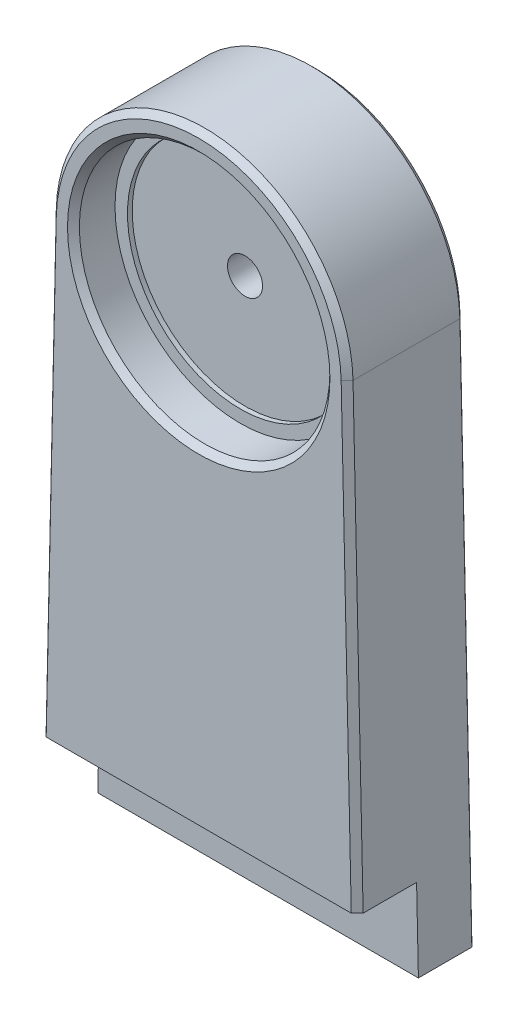
ISO-10303-21;
HEADER;
FILE_DESCRIPTION(('STEP AP214'),'2;1');
FILE_NAME('part.step','',(''),(''),'','','');
FILE_SCHEMA(('AUTOMOTIVE_DESIGN { 1 0 10303 214 1 1 1 1 }'));
ENDSEC;
DATA;
#1=APPLICATION_CONTEXT('core data for automotive mechanical design processes');
#2=APPLICATION_PROTOCOL_DEFINITION('international standard','automotive_design',2000,#1);
#3=PRODUCT_CONTEXT('',#1,'mechanical');
#4=PRODUCT('Part','Part','',(#3));
#5=PRODUCT_RELATED_PRODUCT_CATEGORY('part','',(#4));
#6=PRODUCT_DEFINITION_FORMATION('','',#4);
#7=PRODUCT_DEFINITION_CONTEXT('part definition',#1,'design');
#8=PRODUCT_DEFINITION('design','',#6,#7);
#9=PRODUCT_DEFINITION_SHAPE('','',#8);
#10=(LENGTH_UNIT() NAMED_UNIT(*) SI_UNIT(.MILLI.,.METRE.));
#11=(NAMED_UNIT(*) PLANE_ANGLE_UNIT() SI_UNIT($,.RADIAN.));
#12=(NAMED_UNIT(*) SI_UNIT($,.STERADIAN.) SOLID_ANGLE_UNIT());
#13=UNCERTAINTY_MEASURE_WITH_UNIT(LENGTH_MEASURE(1.E-05),#10,'distance_accuracy_value','');
#14=(GEOMETRIC_REPRESENTATION_CONTEXT(3) GLOBAL_UNCERTAINTY_ASSIGNED_CONTEXT((#13)) GLOBAL_UNIT_ASSIGNED_CONTEXT((#10,
#11,#12)) REPRESENTATION_CONTEXT('',''));
#15=CARTESIAN_POINT('',(0.,0.,0.));
#16=DIRECTION('',(0.,0.,1.));
#17=DIRECTION('',(1.,0.,0.));
#18=AXIS2_PLACEMENT_3D('',#15,#16,#17);
#19=CARTESIAN_POINT('',(-15.,-83.,20.));
#20=DIRECTION('',(0.,0.,-1.));
#21=DIRECTION('',(-1.,0.,0.));
#22=AXIS2_PLACEMENT_3D('',#19,#20,#21);
#23=CYLINDRICAL_SURFACE('',#22,1.55);
#24=CARTESIAN_POINT('',(-15.,-83.,10.));
#25=DIRECTION('',(0.,0.,-1.));
#26=DIRECTION('',(-1.,0.,0.));
#27=AXIS2_PLACEMENT_3D('',#24,#25,#26);
#28=CIRCLE('',#27,1.55);
#29=CARTESIAN_POINT('',(-16.55,-83.,10.));
#30=VERTEX_POINT('',#29);
#31=EDGE_CURVE('E290',#30,#30,#28,.T.);
#32=ORIENTED_EDGE('',*,*,#31,.F.);
#33=EDGE_LOOP('',(#32));
#34=FACE_BOUND('',#33,.T.);
#35=CARTESIAN_POINT('',(-15.,-83.,3.));
#36=DIRECTION('',(0.,0.,-1.));
#37=DIRECTION('',(-1.,0.,0.));
#38=AXIS2_PLACEMENT_3D('',#35,#36,#37);
#39=CIRCLE('',#38,1.55);
#40=CARTESIAN_POINT('',(-16.55,-83.,3.));
#41=VERTEX_POINT('',#40);
#42=EDGE_CURVE('E43',#41,#41,#39,.T.);
#43=ORIENTED_EDGE('',*,*,#42,.T.);
#44=EDGE_LOOP('',(#43));
#45=FACE_BOUND('',#44,.T.);
#46=ADVANCED_FACE('F38',(#34,#45),#23,.F.);
#47=CARTESIAN_POINT('',(0.,-83.,20.));
#48=DIRECTION('',(0.,0.,-1.));
#49=DIRECTION('',(-1.,0.,0.));
#50=AXIS2_PLACEMENT_3D('',#47,#48,#49);
#51=CYLINDRICAL_SURFACE('',#50,1.55);
#52=CARTESIAN_POINT('',(0.,-83.,10.));
#53=DIRECTION('',(0.,0.,-1.));
#54=DIRECTION('',(-1.,0.,0.));
#55=AXIS2_PLACEMENT_3D('',#52,#53,#54);
#56=CIRCLE('',#55,1.55);
#57=CARTESIAN_POINT('',(-1.55,-83.,10.));
#58=VERTEX_POINT('',#57);
#59=EDGE_CURVE('E158',#58,#58,#56,.T.);
#60=ORIENTED_EDGE('',*,*,#59,.F.);
#61=EDGE_LOOP('',(#60));
#62=FACE_BOUND('',#61,.T.);
#63=CARTESIAN_POINT('',(0.,-83.,3.));
#64=DIRECTION('',(0.,0.,-1.));
#65=DIRECTION('',(-1.,0.,0.));
#66=AXIS2_PLACEMENT_3D('',#63,#64,#65);
#67=CIRCLE('',#66,1.55);
#68=CARTESIAN_POINT('',(-1.55,-83.,3.));
#69=VERTEX_POINT('',#68);
#70=EDGE_CURVE('E253',#69,#69,#67,.T.);
#71=ORIENTED_EDGE('',*,*,#70,.T.);
#72=EDGE_LOOP('',(#71));
#73=FACE_BOUND('',#72,.T.);
#74=ADVANCED_FACE('F362',(#62,#73),#51,.F.);
#75=CARTESIAN_POINT('',(15.,-83.,20.));
#76=DIRECTION('',(0.,0.,-1.));
#77=DIRECTION('',(-1.,0.,0.));
#78=AXIS2_PLACEMENT_3D('',#75,#76,#77);
#79=CYLINDRICAL_SURFACE('',#78,1.55);
#80=CARTESIAN_POINT('',(15.,-83.,10.));
#81=DIRECTION('',(0.,0.,-1.));
#82=DIRECTION('',(-1.,0.,0.));
#83=AXIS2_PLACEMENT_3D('',#80,#81,#82);
#84=CIRCLE('',#83,1.55);
#85=CARTESIAN_POINT('',(13.45,-83.,10.));
#86=VERTEX_POINT('',#85);
#87=EDGE_CURVE('E155',#86,#86,#84,.T.);
#88=ORIENTED_EDGE('',*,*,#87,.F.);
#89=EDGE_LOOP('',(#88));
#90=FACE_BOUND('',#89,.T.);
#91=CARTESIAN_POINT('',(15.,-83.,3.));
#92=DIRECTION('',(0.,0.,-1.));
#93=DIRECTION('',(-1.,0.,0.));
#94=AXIS2_PLACEMENT_3D('',#91,#92,#93);
#95=CIRCLE('',#94,1.55);
#96=CARTESIAN_POINT('',(13.45,-83.,3.));
#97=VERTEX_POINT('',#96);
#98=EDGE_CURVE('E250',#97,#97,#95,.T.);
#99=ORIENTED_EDGE('',*,*,#98,.T.);
#100=EDGE_LOOP('',(#99));
#101=FACE_BOUND('',#100,.T.);
#102=ADVANCED_FACE('F330',(#90,#101),#79,.F.);
#103=CARTESIAN_POINT('',(0.,0.,20.));
#104=DIRECTION('',(0.,0.,-1.));
#105=DIRECTION('',(-1.,0.,0.));
#106=AXIS2_PLACEMENT_3D('',#103,#104,#105);
#107=CYLINDRICAL_SURFACE('',#106,2.95);
#108=CARTESIAN_POINT('',(0.,0.,0.));
#109=DIRECTION('',(0.,0.,1.));
#110=DIRECTION('',(1.,0.,0.));
#111=AXIS2_PLACEMENT_3D('',#108,#109,#110);
#112=CIRCLE('',#111,2.95);
#113=CARTESIAN_POINT('',(2.95,0.,0.));
#114=VERTEX_POINT('',#113);
#115=EDGE_CURVE('E295',#114,#114,#112,.T.);
#116=ORIENTED_EDGE('',*,*,#115,.F.);
#117=EDGE_LOOP('',(#116));
#118=FACE_BOUND('',#117,.T.);
#119=CARTESIAN_POINT('',(0.,0.,12.2));
#120=DIRECTION('',(0.,0.,1.));
#121=DIRECTION('',(1.,0.,0.));
#122=AXIS2_PLACEMENT_3D('',#119,#120,#121);
#123=CIRCLE('',#122,2.95);
#124=CARTESIAN_POINT('',(2.95,0.,12.2));
#125=VERTEX_POINT('',#124);
#126=EDGE_CURVE('E161',#125,#125,#123,.T.);
#127=ORIENTED_EDGE('',*,*,#126,.T.);
#128=EDGE_LOOP('',(#127));
#129=FACE_BOUND('',#128,.T.);
#130=ADVANCED_FACE('F327',(#118,#129),#107,.F.);
#131=CARTESIAN_POINT('',(0.,0.,20.));
#132=DIRECTION('',(0.,0.,1.));
#133=DIRECTION('',(1.,0.,0.));
#134=AXIS2_PLACEMENT_3D('',#131,#132,#133);
#135=PLANE('',#134);
#136=CARTESIAN_POINT('',(0.,0.,20.));
#137=DIRECTION('',(0.,0.,1.));
#138=DIRECTION('',(1.,0.,0.));
#139=AXIS2_PLACEMENT_3D('',#136,#137,#138);
#140=CIRCLE('',#139,22.1);
#141=CARTESIAN_POINT('',(22.1,0.,20.));
#142=VERTEX_POINT('',#141);
#143=EDGE_CURVE('E194',#142,#142,#140,.F.);
#144=ORIENTED_EDGE('',*,*,#143,.T.);
#145=EDGE_LOOP('',(#144));
#146=FACE_BOUND('',#145,.T.);
#147=DIRECTION('',(-1.,0.,0.));
#148=VECTOR('',#147,1.);
#149=CARTESIAN_POINT('',(-27.,-76.2,20.));
#150=LINE('',#149,#148);
#151=CARTESIAN_POINT('',(25.6939593819547,-76.2,20.));
#152=VERTEX_POINT('',#151);
#153=CARTESIAN_POINT('',(-25.6939919283633,-76.2,20.));
#154=VERTEX_POINT('',#153);
#155=EDGE_CURVE('E140',#152,#154,#150,.T.);
#156=ORIENTED_EDGE('',*,*,#155,.F.);
#157=DIRECTION('',(-0.0221508526224699,0.999754639763226,0.));
#158=VECTOR('',#157,1.);
#159=CARTESIAN_POINT('',(23.9914406171151,0.641332631401685,20.));
#160=LINE('',#159,#158);
#161=CARTESIAN_POINT('',(23.9914897321568,0.63911587741423,20.));
#162=VERTEX_POINT('',#161);
#163=EDGE_CURVE('E192',#152,#162,#160,.T.);
#164=ORIENTED_EDGE('',*,*,#163,.T.);
#165=CARTESIAN_POINT('',(0.,0.,20.));
#166=DIRECTION('',(0.,0.,1.));
#167=DIRECTION('',(1.,0.,0.));
#168=AXIS2_PLACEMENT_3D('',#165,#166,#167);
#169=CIRCLE('',#168,24.0000010140198);
#170=CARTESIAN_POINT('',(-23.9914894068359,0.639128089376715,20.));
#171=VERTEX_POINT('',#170);
#172=EDGE_CURVE('E56',#162,#171,#169,.T.);
#173=ORIENTED_EDGE('',*,*,#172,.T.);
#174=DIRECTION('',(-0.0221512765883186,-0.999754630369626,0.));
#175=VECTOR('',#174,1.);
#176=CARTESIAN_POINT('',(-25.6944827278451,-76.2221512765883,20.));
#177=LINE('',#176,#175);
#178=EDGE_CURVE('E190',#171,#154,#177,.T.);
#179=ORIENTED_EDGE('',*,*,#178,.T.);
#180=EDGE_LOOP('',(#156,#164,#173,#179));
#181=FACE_BOUND('',#180,.T.);
#182=ADVANCED_FACE('F322',(#146,#181),#135,.T.);
#183=CARTESIAN_POINT('',(0.,0.,0.));
#184=DIRECTION('',(0.,0.,1.));
#185=DIRECTION('',(1.,0.,0.));
#186=AXIS2_PLACEMENT_3D('',#183,#184,#185);
#187=PLANE('',#186);
#188=CARTESIAN_POINT('',(0.,-83.,0.));
#189=DIRECTION('',(0.,0.,-1.));
#190=DIRECTION('',(-1.,0.,0.));
#191=AXIS2_PLACEMENT_3D('',#188,#189,#190);
#192=CIRCLE('',#191,3.);
#193=CARTESIAN_POINT('',(-3.,-83.,0.));
#194=VERTEX_POINT('',#193);
#195=EDGE_CURVE('E261',#194,#194,#192,.T.);
#196=ORIENTED_EDGE('',*,*,#195,.F.);
#197=EDGE_LOOP('',(#196));
#198=FACE_BOUND('',#197,.T.);
#199=CARTESIAN_POINT('',(-15.,-83.,0.));
#200=DIRECTION('',(0.,0.,-1.));
#201=DIRECTION('',(-1.,0.,0.));
#202=AXIS2_PLACEMENT_3D('',#199,#200,#201);
#203=CIRCLE('',#202,3.);
#204=CARTESIAN_POINT('',(-18.,-83.,0.));
#205=VERTEX_POINT('',#204);
#206=EDGE_CURVE('E271',#205,#205,#203,.T.);
#207=ORIENTED_EDGE('',*,*,#206,.F.);
#208=EDGE_LOOP('',(#207));
#209=FACE_BOUND('',#208,.T.);
#210=CARTESIAN_POINT('',(15.,-83.,0.));
#211=DIRECTION('',(0.,0.,-1.));
#212=DIRECTION('',(-1.,0.,0.));
#213=AXIS2_PLACEMENT_3D('',#210,#211,#212);
#214=CIRCLE('',#213,3.);
#215=CARTESIAN_POINT('',(12.,-83.,0.));
#216=VERTEX_POINT('',#215);
#217=EDGE_CURVE('E259',#216,#216,#214,.T.);
#218=ORIENTED_EDGE('',*,*,#217,.F.);
#219=EDGE_LOOP('',(#218));
#220=FACE_BOUND('',#219,.T.);
#221=DIRECTION('',(1.,0.,0.));
#222=VECTOR('',#221,1.);
#223=CARTESIAN_POINT('',(0.,-90.,0.));
#224=LINE('',#223,#222);
#225=CARTESIAN_POINT('',(-25.9997545701486,-90.,0.));
#226=VERTEX_POINT('',#225);
#227=CARTESIAN_POINT('',(25.9997161687024,-90.,0.));
#228=VERTEX_POINT('',#227);
#229=EDGE_CURVE('E298',#226,#228,#224,.T.);
#230=ORIENTED_EDGE('',*,*,#229,.F.);
#231=DIRECTION('',(0.0221512765883186,0.999754630369626,0.));
#232=VECTOR('',#231,1.);
#233=CARTESIAN_POINT('',(-23.9938713147598,0.531625324627168,0.));
#234=LINE('',#233,#232);
#235=CARTESIAN_POINT('',(-23.9914894068359,0.639128089377514,0.));
#236=VERTEX_POINT('',#235);
#237=EDGE_CURVE('E176',#226,#236,#234,.T.);
#238=ORIENTED_EDGE('',*,*,#237,.T.);
#239=CARTESIAN_POINT('',(0.,0.,0.));
#240=DIRECTION('',(0.,0.,1.));
#241=DIRECTION('',(1.,0.,0.));
#242=AXIS2_PLACEMENT_3D('',#239,#240,#241);
#243=CIRCLE('',#242,24.0000010140198);
#244=CARTESIAN_POINT('',(23.9914897321569,0.639115877415421,0.));
#245=VERTEX_POINT('',#244);
#246=EDGE_CURVE('E174',#236,#245,#243,.F.);
#247=ORIENTED_EDGE('',*,*,#246,.T.);
#248=DIRECTION('',(0.0221508526224699,-0.999754639763226,0.));
#249=VECTOR('',#248,1.);
#250=CARTESIAN_POINT('',(23.9938715493354,0.531615149750818,0.));
#251=LINE('',#250,#249);
#252=EDGE_CURVE('E172',#245,#228,#251,.T.);
#253=ORIENTED_EDGE('',*,*,#252,.T.);
#254=EDGE_LOOP('',(#230,#238,#247,#253));
#255=FACE_BOUND('',#254,.T.);
#256=ORIENTED_EDGE('',*,*,#115,.T.);
#257=EDGE_LOOP('',(#256));
#258=FACE_BOUND('',#257,.T.);
#259=ADVANCED_FACE('F319',(#198,#209,#220,#255,#258),#187,.F.);
#260=CARTESIAN_POINT('',(0.,0.,20.));
#261=DIRECTION('',(0.,0.,-1.));
#262=DIRECTION('',(-1.,0.,0.));
#263=AXIS2_PLACEMENT_3D('',#260,#261,#262);
#264=CYLINDRICAL_SURFACE('',#263,25.0000010140198);
#265=DIRECTION('',(0.,0.,-1.));
#266=VECTOR('',#265,1.);
#267=CARTESIAN_POINT('',(24.9911952568783,0.663483484024156,20.));
#268=LINE('',#267,#266);
#269=CARTESIAN_POINT('',(24.9911952568783,0.663483484024156,19.));
#270=VERTEX_POINT('',#269);
#271=CARTESIAN_POINT('',(24.9911952568783,0.663483484024156,1.));
#272=VERTEX_POINT('',#271);
#273=EDGE_CURVE('E151',#270,#272,#268,.T.);
#274=ORIENTED_EDGE('',*,*,#273,.T.);
#275=CARTESIAN_POINT('',(0.,0.,1.));
#276=DIRECTION('',(0.,0.,1.));
#277=DIRECTION('',(1.,0.,0.));
#278=AXIS2_PLACEMENT_3D('',#275,#276,#277);
#279=CIRCLE('',#278,25.0000010140198);
#280=CARTESIAN_POINT('',(-24.9911949202926,0.663496161958768,1.));
#281=VERTEX_POINT('',#280);
#282=EDGE_CURVE('E180',#272,#281,#279,.T.);
#283=ORIENTED_EDGE('',*,*,#282,.T.);
#284=DIRECTION('',(0.,0.,-1.));
#285=VECTOR('',#284,1.);
#286=CARTESIAN_POINT('',(-24.9911949202926,0.663496161958768,20.));
#287=LINE('',#286,#285);
#288=CARTESIAN_POINT('',(-24.9911949202926,0.663496161958768,19.));
#289=VERTEX_POINT('',#288);
#290=EDGE_CURVE('E147',#289,#281,#287,.T.);
#291=ORIENTED_EDGE('',*,*,#290,.F.);
#292=CARTESIAN_POINT('',(0.,0.,19.));
#293=DIRECTION('',(0.,0.,1.));
#294=DIRECTION('',(1.,0.,0.));
#295=AXIS2_PLACEMENT_3D('',#292,#293,#294);
#296=CIRCLE('',#295,25.0000010140198);
#297=EDGE_CURVE('E178',#289,#270,#296,.F.);
#298=ORIENTED_EDGE('',*,*,#297,.T.);
#299=EDGE_LOOP('',(#274,#283,#291,#298));
#300=FACE_BOUND('',#299,.T.);
#301=ADVANCED_FACE('F304',(#300),#264,.T.);
#302=CARTESIAN_POINT('',(-24.9911949202926,0.663496161958768,20.));
#303=DIRECTION('',(0.999754630369626,-0.0221512765883186,0.));
#304=DIRECTION('',(0.0221512765883186,0.999754630369626,0.));
#305=AXIS2_PLACEMENT_3D('',#302,#303,#304);
#306=PLANE('',#305);
#307=ORIENTED_EDGE('',*,*,#290,.T.);
#308=DIRECTION('',(-0.0221512765883186,-0.999754630369626,0.));
#309=VECTOR('',#308,1.);
#310=CARTESIAN_POINT('',(-24.9911949202926,0.663496161958768,1.));
#311=LINE('',#310,#309);
#312=CARTESIAN_POINT('',(-27.,-90.,1.));
#313=VERTEX_POINT('',#312);
#314=EDGE_CURVE('E146',#281,#313,#311,.T.);
#315=ORIENTED_EDGE('',*,*,#314,.T.);
#316=DIRECTION('',(0.,0.,-1.));
#317=VECTOR('',#316,1.);
#318=CARTESIAN_POINT('',(-27.,-90.,20.));
#319=LINE('',#318,#317);
#320=CARTESIAN_POINT('',(-27.,-90.,10.));
#321=VERTEX_POINT('',#320);
#322=EDGE_CURVE('E137',#321,#313,#319,.T.);
#323=ORIENTED_EDGE('',*,*,#322,.F.);
#324=DIRECTION('',(0.0221512765883186,0.999754630369626,0.));
#325=VECTOR('',#324,1.);
#326=CARTESIAN_POINT('',(-24.9911949202926,0.663496161958768,10.));
#327=LINE('',#326,#325);
#328=CARTESIAN_POINT('',(-26.6942373582148,-76.2,10.));
#329=VERTEX_POINT('',#328);
#330=EDGE_CURVE('E119',#321,#329,#327,.T.);
#331=ORIENTED_EDGE('',*,*,#330,.T.);
#332=DIRECTION('',(0.,0.,1.));
#333=VECTOR('',#332,1.);
#334=CARTESIAN_POINT('',(-26.6942373582148,-76.2,20.));
#335=LINE('',#334,#333);
#336=CARTESIAN_POINT('',(-26.6942373582148,-76.2,19.));
#337=VERTEX_POINT('',#336);
#338=EDGE_CURVE('E130',#329,#337,#335,.T.);
#339=ORIENTED_EDGE('',*,*,#338,.T.);
#340=DIRECTION('',(0.0221512765883186,0.999754630369626,0.));
#341=VECTOR('',#340,1.);
#342=CARTESIAN_POINT('',(-24.9911949202926,0.663496161958768,19.));
#343=LINE('',#342,#341);
#344=EDGE_CURVE('E160',#337,#289,#343,.T.);
#345=ORIENTED_EDGE('',*,*,#344,.T.);
#346=EDGE_LOOP('',(#307,#315,#323,#331,#339,#345));
#347=FACE_BOUND('',#346,.T.);
#348=ADVANCED_FACE('F144',(#347),#306,.F.);
#349=CARTESIAN_POINT('',(0.,-90.,20.));
#350=DIRECTION('',(0.,1.,0.));
#351=DIRECTION('',(0.,0.,1.));
#352=AXIS2_PLACEMENT_3D('',#349,#350,#351);
#353=PLANE('',#352);
#354=ORIENTED_EDGE('',*,*,#322,.T.);
#355=DIRECTION('',(-0.707193537772192,0.,0.707020013955228));
#356=VECTOR('',#355,1.);
#357=CARTESIAN_POINT('',(-25.9953509800307,-90.,-0.00440250961062597));
#358=LINE('',#357,#356);
#359=EDGE_CURVE('E170',#313,#226,#358,.F.);
#360=ORIENTED_EDGE('',*,*,#359,.T.);
#361=ORIENTED_EDGE('',*,*,#229,.T.);
#362=DIRECTION('',(-0.707193534450645,0.,-0.707020017277591));
#363=VECTOR('',#362,1.);
#364=CARTESIAN_POINT('',(25.9953319570928,-90.,-0.0043831358984539));
#365=LINE('',#364,#363);
#366=CARTESIAN_POINT('',(26.9999615891556,-90.,1.));
#367=VERTEX_POINT('',#366);
#368=EDGE_CURVE('E168',#228,#367,#365,.F.);
#369=ORIENTED_EDGE('',*,*,#368,.T.);
#370=DIRECTION('',(0.,0.,-1.));
#371=VECTOR('',#370,1.);
#372=CARTESIAN_POINT('',(26.9999615891556,-90.,20.));
#373=LINE('',#372,#371);
#374=CARTESIAN_POINT('',(26.9999615891556,-90.,10.));
#375=VERTEX_POINT('',#374);
#376=EDGE_CURVE('E139',#375,#367,#373,.T.);
#377=ORIENTED_EDGE('',*,*,#376,.F.);
#378=DIRECTION('',(1.,0.,0.));
#379=VECTOR('',#378,1.);
#380=CARTESIAN_POINT('',(26.9999615891556,-90.,10.));
#381=LINE('',#380,#379);
#382=EDGE_CURVE('E123',#321,#375,#381,.T.);
#383=ORIENTED_EDGE('',*,*,#382,.F.);
#384=EDGE_LOOP('',(#354,#360,#361,#369,#377,#383));
#385=FACE_BOUND('',#384,.T.);
#386=ADVANCED_FACE('F136',(#385),#353,.F.);
#387=CARTESIAN_POINT('',(24.9911952568783,0.663483484024156,20.));
#388=DIRECTION('',(-0.999754639763226,-0.0221508526224699,0.));
#389=DIRECTION('',(0.0221508526224699,-0.999754639763226,0.));
#390=AXIS2_PLACEMENT_3D('',#387,#388,#389);
#391=PLANE('',#390);
#392=ORIENTED_EDGE('',*,*,#376,.T.);
#393=DIRECTION('',(-0.0221508526224699,0.999754639763226,0.));
#394=VECTOR('',#393,1.);
#395=CARTESIAN_POINT('',(24.9911952568783,0.663483484024156,1.));
#396=LINE('',#395,#394);
#397=EDGE_CURVE('E184',#367,#272,#396,.T.);
#398=ORIENTED_EDGE('',*,*,#397,.T.);
#399=ORIENTED_EDGE('',*,*,#273,.F.);
#400=DIRECTION('',(0.0221508526224699,-0.999754639763226,0.));
#401=VECTOR('',#400,1.);
#402=CARTESIAN_POINT('',(26.6942048024079,-76.2,19.));
#403=LINE('',#402,#401);
#404=CARTESIAN_POINT('',(26.6942048024079,-76.2,19.));
#405=VERTEX_POINT('',#404);
#406=EDGE_CURVE('E182',#270,#405,#403,.T.);
#407=ORIENTED_EDGE('',*,*,#406,.T.);
#408=DIRECTION('',(0.,0.,-1.));
#409=VECTOR('',#408,1.);
#410=CARTESIAN_POINT('',(26.6942048024079,-76.2,20.));
#411=LINE('',#410,#409);
#412=CARTESIAN_POINT('',(26.6942048024079,-76.2,10.));
#413=VERTEX_POINT('',#412);
#414=EDGE_CURVE('E149',#405,#413,#411,.T.);
#415=ORIENTED_EDGE('',*,*,#414,.T.);
#416=DIRECTION('',(0.0221508526224699,-0.999754639763226,0.));
#417=VECTOR('',#416,1.);
#418=CARTESIAN_POINT('',(24.9911952568783,0.663483484024156,10.));
#419=LINE('',#418,#417);
#420=EDGE_CURVE('E131',#413,#375,#419,.T.);
#421=ORIENTED_EDGE('',*,*,#420,.T.);
#422=EDGE_LOOP('',(#392,#398,#399,#407,#415,#421));
#423=FACE_BOUND('',#422,.T.);
#424=ADVANCED_FACE('F376',(#423),#391,.F.);
#425=CARTESIAN_POINT('',(-27.,-76.2,10.));
#426=DIRECTION('',(0.,1.,0.));
#427=DIRECTION('',(0.,0.,1.));
#428=AXIS2_PLACEMENT_3D('',#425,#426,#427);
#429=PLANE('',#428);
#430=ORIENTED_EDGE('',*,*,#414,.F.);
#431=DIRECTION('',(-0.707193534450644,0.,0.707020017277592));
#432=VECTOR('',#431,1.);
#433=CARTESIAN_POINT('',(24.8437068730814,-76.2,20.8500438907164));
#434=LINE('',#433,#432);
#435=EDGE_CURVE('E11',#405,#152,#434,.T.);
#436=ORIENTED_EDGE('',*,*,#435,.T.);
#437=ORIENTED_EDGE('',*,*,#155,.T.);
#438=DIRECTION('',(-0.707193537772191,0.,-0.70702001395523));
#439=VECTOR('',#438,1.);
#440=CARTESIAN_POINT('',(-24.8437230169888,-76.2,20.850060281206));
#441=LINE('',#440,#439);
#442=EDGE_CURVE('E48',#154,#337,#441,.T.);
#443=ORIENTED_EDGE('',*,*,#442,.T.);
#444=ORIENTED_EDGE('',*,*,#338,.F.);
#445=DIRECTION('',(-1.,0.,0.));
#446=VECTOR('',#445,1.);
#447=CARTESIAN_POINT('',(-27.,-76.2,10.));
#448=LINE('',#447,#446);
#449=EDGE_CURVE('E126',#413,#329,#448,.T.);
#450=ORIENTED_EDGE('',*,*,#449,.F.);
#451=EDGE_LOOP('',(#430,#436,#437,#443,#444,#450));
#452=FACE_BOUND('',#451,.T.);
#453=ADVANCED_FACE('F358',(#452),#429,.F.);
#454=CARTESIAN_POINT('',(0.,0.,10.));
#455=DIRECTION('',(0.,0.,-1.));
#456=DIRECTION('',(-1.,0.,0.));
#457=AXIS2_PLACEMENT_3D('',#454,#455,#456);
#458=PLANE('',#457);
#459=ORIENTED_EDGE('',*,*,#31,.T.);
#460=EDGE_LOOP('',(#459));
#461=FACE_BOUND('',#460,.T.);
#462=ORIENTED_EDGE('',*,*,#59,.T.);
#463=EDGE_LOOP('',(#462));
#464=FACE_BOUND('',#463,.T.);
#465=ORIENTED_EDGE('',*,*,#87,.T.);
#466=EDGE_LOOP('',(#465));
#467=FACE_BOUND('',#466,.T.);
#468=ORIENTED_EDGE('',*,*,#382,.T.);
#469=ORIENTED_EDGE('',*,*,#420,.F.);
#470=ORIENTED_EDGE('',*,*,#449,.T.);
#471=ORIENTED_EDGE('',*,*,#330,.F.);
#472=EDGE_LOOP('',(#468,#469,#470,#471));
#473=FACE_BOUND('',#472,.T.);
#474=ADVANCED_FACE('F121',(#461,#464,#467,#473),#458,.F.);
#475=CARTESIAN_POINT('',(0.,0.,13.));
#476=DIRECTION('',(0.,0.,1.));
#477=DIRECTION('',(1.,0.,0.));
#478=AXIS2_PLACEMENT_3D('',#475,#476,#477);
#479=CYLINDRICAL_SURFACE('',#478,21.1);
#480=CARTESIAN_POINT('',(0.,0.,19.));
#481=DIRECTION('',(0.,0.,1.));
#482=DIRECTION('',(1.,0.,0.));
#483=AXIS2_PLACEMENT_3D('',#480,#481,#482);
#484=CIRCLE('',#483,21.1);
#485=CARTESIAN_POINT('',(21.1,0.,19.));
#486=VERTEX_POINT('',#485);
#487=EDGE_CURVE('E186',#486,#486,#484,.T.);
#488=ORIENTED_EDGE('',*,*,#487,.T.);
#489=EDGE_LOOP('',(#488));
#490=FACE_BOUND('',#489,.T.);
#491=CARTESIAN_POINT('',(0.,0.,13.));
#492=DIRECTION('',(0.,0.,1.));
#493=DIRECTION('',(1.,0.,0.));
#494=AXIS2_PLACEMENT_3D('',#491,#492,#493);
#495=CIRCLE('',#494,21.1);
#496=CARTESIAN_POINT('',(21.1,0.,13.));
#497=VERTEX_POINT('',#496);
#498=EDGE_CURVE('E164',#497,#497,#495,.T.);
#499=ORIENTED_EDGE('',*,*,#498,.F.);
#500=EDGE_LOOP('',(#499));
#501=FACE_BOUND('',#500,.T.);
#502=ADVANCED_FACE('F348',(#490,#501),#479,.F.);
#503=CARTESIAN_POINT('',(0.,0.,13.));
#504=DIRECTION('',(0.,0.,1.));
#505=DIRECTION('',(1.,0.,0.));
#506=AXIS2_PLACEMENT_3D('',#503,#504,#505);
#507=PLANE('',#506);
#508=CARTESIAN_POINT('',(0.,0.,13.));
#509=DIRECTION('',(0.,0.,1.));
#510=DIRECTION('',(1.,0.,0.));
#511=AXIS2_PLACEMENT_3D('',#508,#509,#510);
#512=CIRCLE('',#511,19.);
#513=CARTESIAN_POINT('',(19.,0.,13.));
#514=VERTEX_POINT('',#513);
#515=EDGE_CURVE('E280',#514,#514,#512,.T.);
#516=ORIENTED_EDGE('',*,*,#515,.F.);
#517=EDGE_LOOP('',(#516));
#518=FACE_BOUND('',#517,.T.);
#519=ORIENTED_EDGE('',*,*,#498,.T.);
#520=EDGE_LOOP('',(#519));
#521=FACE_BOUND('',#520,.T.);
#522=ADVANCED_FACE('F342',(#518,#521),#507,.T.);
#523=CARTESIAN_POINT('',(0.,0.,12.2));
#524=DIRECTION('',(0.,0.,1.));
#525=DIRECTION('',(1.,0.,0.));
#526=AXIS2_PLACEMENT_3D('',#523,#524,#525);
#527=CYLINDRICAL_SURFACE('',#526,19.);
#528=CARTESIAN_POINT('',(0.,0.,12.2));
#529=DIRECTION('',(0.,0.,1.));
#530=DIRECTION('',(1.,0.,0.));
#531=AXIS2_PLACEMENT_3D('',#528,#529,#530);
#532=CIRCLE('',#531,19.);
#533=CARTESIAN_POINT('',(19.,0.,12.2));
#534=VERTEX_POINT('',#533);
#535=EDGE_CURVE('E165',#534,#534,#532,.T.);
#536=ORIENTED_EDGE('',*,*,#535,.F.);
#537=EDGE_LOOP('',(#536));
#538=FACE_BOUND('',#537,.T.);
#539=ORIENTED_EDGE('',*,*,#515,.T.);
#540=EDGE_LOOP('',(#539));
#541=FACE_BOUND('',#540,.T.);
#542=ADVANCED_FACE('F336',(#538,#541),#527,.F.);
#543=CARTESIAN_POINT('',(0.,0.,12.2));
#544=DIRECTION('',(0.,0.,1.));
#545=DIRECTION('',(1.,0.,0.));
#546=AXIS2_PLACEMENT_3D('',#543,#544,#545);
#547=PLANE('',#546);
#548=ORIENTED_EDGE('',*,*,#126,.F.);
#549=EDGE_LOOP('',(#548));
#550=FACE_BOUND('',#549,.T.);
#551=ORIENTED_EDGE('',*,*,#535,.T.);
#552=EDGE_LOOP('',(#551));
#553=FACE_BOUND('',#552,.T.);
#554=ADVANCED_FACE('F227',(#550,#553),#547,.T.);
#555=CARTESIAN_POINT('',(24.9911952568783,0.663483484024156,1.));
#556=DIRECTION('',(-0.706933285299293,-0.0156630180984123,0.707106781186546));
#557=DIRECTION('',(-0.0221508526224699,0.999754639763226,0.));
#558=AXIS2_PLACEMENT_3D('',#555,#556,#557);
#559=PLANE('',#558);
#560=ORIENTED_EDGE('',*,*,#368,.F.);
#561=ORIENTED_EDGE('',*,*,#252,.F.);
#562=CARTESIAN_POINT('',(23.9914897321569,0.639115877415421,0.));
#563=CARTESIAN_POINT('',(24.1581072318927,0.643180915482489,0.166666662485819));
#564=CARTESIAN_POINT('',(24.3247247754876,0.647244068400102,0.33333332706217));
#565=CARTESIAN_POINT('',(24.6579599503947,0.655366603936411,0.666666660395504));
#566=CARTESIAN_POINT('',(24.8245775817071,0.659425986555106,0.833333329152486));
#567=CARTESIAN_POINT('',(24.9911952568783,0.663483484024347,1.));
#568=B_SPLINE_CURVE_WITH_KNOTS('',3,(#562,#563,#564,#565,#566,#567),.UNSPECIFIED.,.F.,.F.,(4,2,
4),(0.,0.70710765031637,1.41421530063089),.UNSPECIFIED.);
#569=EDGE_CURVE('E207',#272,#245,#568,.F.);
#570=ORIENTED_EDGE('',*,*,#569,.F.);
#571=ORIENTED_EDGE('',*,*,#397,.F.);
#572=EDGE_LOOP('',(#560,#561,#570,#571));
#573=FACE_BOUND('',#572,.T.);
#574=ADVANCED_FACE('F223',(#573),#559,.F.);
#575=CARTESIAN_POINT('',(0.,0.,1.));
#576=DIRECTION('',(0.,0.,1.));
#577=DIRECTION('',(1.,0.,0.));
#578=AXIS2_PLACEMENT_3D('',#575,#576,#577);
#579=CONICAL_SURFACE('',#578,25.0000010140198,0.785398163397445);
#580=ORIENTED_EDGE('',*,*,#569,.T.);
#581=ORIENTED_EDGE('',*,*,#246,.F.);
#582=CARTESIAN_POINT('',(-23.9914894068359,0.639128089377514,0.));
#583=CARTESIAN_POINT('',(-24.158106904691,0.643193205177768,0.16666666248566));
#584=CARTESIAN_POINT('',(-24.3247244464067,0.647256435792999,0.333333327061932));
#585=CARTESIAN_POINT('',(-24.6579596175589,0.655379126653405,0.666666660395265));
#586=CARTESIAN_POINT('',(-24.8245772469954,0.659438586898579,0.833333329152326));
#587=CARTESIAN_POINT('',(-24.9911949202926,0.663496161958731,0.999999999999999));
#588=B_SPLINE_CURVE_WITH_KNOTS('',3,(#582,#583,#584,#585,#586,#587),.UNSPECIFIED.,.F.,.F.,(4,2,
4),(0.,0.707107650349327,1.4142153006968),.UNSPECIFIED.);
#589=EDGE_CURVE('E198',#281,#236,#588,.F.);
#590=ORIENTED_EDGE('',*,*,#589,.F.);
#591=ORIENTED_EDGE('',*,*,#282,.F.);
#592=EDGE_LOOP('',(#580,#581,#590,#591));
#593=FACE_BOUND('',#592,.T.);
#594=ADVANCED_FACE('F215',(#593),#579,.T.);
#595=CARTESIAN_POINT('',(-24.9911949202926,0.663496161958768,1.));
#596=DIRECTION('',(0.706933278657014,-0.0156633178875389,0.707106781186546));
#597=DIRECTION('',(-0.0221512765883186,-0.999754630369626,0.));
#598=AXIS2_PLACEMENT_3D('',#595,#596,#597);
#599=PLANE('',#598);
#600=ORIENTED_EDGE('',*,*,#589,.T.);
#601=ORIENTED_EDGE('',*,*,#237,.F.);
#602=ORIENTED_EDGE('',*,*,#359,.F.);
#603=ORIENTED_EDGE('',*,*,#314,.F.);
#604=EDGE_LOOP('',(#600,#601,#602,#603));
#605=FACE_BOUND('',#604,.T.);
#606=ADVANCED_FACE('F218',(#605),#599,.F.);
#607=CARTESIAN_POINT('',(0.,0.,19.));
#608=DIRECTION('',(0.,0.,1.));
#609=DIRECTION('',(1.,0.,0.));
#610=AXIS2_PLACEMENT_3D('',#607,#608,#609);
#611=CONICAL_SURFACE('',#610,21.1,0.785398163397447);
#612=ORIENTED_EDGE('',*,*,#143,.F.);
#613=EDGE_LOOP('',(#612));
#614=FACE_BOUND('',#613,.T.);
#615=ORIENTED_EDGE('',*,*,#487,.F.);
#616=EDGE_LOOP('',(#615));
#617=FACE_BOUND('',#616,.T.);
#618=ADVANCED_FACE('F221',(#614,#617),#611,.F.);
#619=CARTESIAN_POINT('',(-23.9938713147598,0.531625324627168,20.));
#620=DIRECTION('',(-0.706933278657015,0.0156633178875389,0.707106781186545));
#621=DIRECTION('',(0.0221512765883186,0.999754630369626,0.));
#622=AXIS2_PLACEMENT_3D('',#619,#620,#621);
#623=PLANE('',#622);
#624=ORIENTED_EDGE('',*,*,#442,.F.);
#625=ORIENTED_EDGE('',*,*,#178,.F.);
#626=CARTESIAN_POINT('',(-24.9911949202926,0.663496161958768,19.));
#627=CARTESIAN_POINT('',(-24.8245772469954,0.659438586898762,19.1666666708476));
#628=CARTESIAN_POINT('',(-24.6579596175589,0.655379126653601,19.3333333396047));
#629=CARTESIAN_POINT('',(-24.3247244464067,0.647256435792958,19.6666666729381));
#630=CARTESIAN_POINT('',(-24.158106904691,0.643193205177476,19.8333333375143));
#631=CARTESIAN_POINT('',(-23.9914894068359,0.639128089376838,20.));
#632=B_SPLINE_CURVE_WITH_KNOTS('',3,(#626,#627,#628,#629,#630,#631),.UNSPECIFIED.,.F.,.F.,(4,2,
4),(0.,0.707107650347509,1.41421530069687),.UNSPECIFIED.);
#633=EDGE_CURVE('E208',#289,#171,#632,.T.);
#634=ORIENTED_EDGE('',*,*,#633,.F.);
#635=ORIENTED_EDGE('',*,*,#344,.F.);
#636=EDGE_LOOP('',(#624,#625,#634,#635));
#637=FACE_BOUND('',#636,.T.);
#638=ADVANCED_FACE('F40',(#637),#623,.T.);
#639=CARTESIAN_POINT('',(0.,0.,20.));
#640=DIRECTION('',(0.,0.,-1.));
#641=DIRECTION('',(-1.,0.,0.));
#642=AXIS2_PLACEMENT_3D('',#639,#640,#641);
#643=CONICAL_SURFACE('',#642,24.0000010140198,0.785398163397445);
#644=ORIENTED_EDGE('',*,*,#633,.T.);
#645=ORIENTED_EDGE('',*,*,#172,.F.);
#646=CARTESIAN_POINT('',(23.9914897321568,0.63911587741423,20.));
#647=CARTESIAN_POINT('',(24.1581072318927,0.643180915481198,19.8333333375142));
#648=CARTESIAN_POINT('',(24.3247247754876,0.64724406839888,19.6666666729378));
#649=CARTESIAN_POINT('',(24.6579599503947,0.655366603935658,19.3333333396045));
#650=CARTESIAN_POINT('',(24.8245775817071,0.659425986554756,19.1666666708475));
#651=CARTESIAN_POINT('',(24.9911952568783,0.663483484024566,19.));
#652=B_SPLINE_CURVE_WITH_KNOTS('',3,(#646,#647,#648,#649,#650,#651),.UNSPECIFIED.,.F.,.F.,(4,2,
4),(0.,0.707107650316398,1.41421530063095),.UNSPECIFIED.);
#653=EDGE_CURVE('E64',#270,#162,#652,.F.);
#654=ORIENTED_EDGE('',*,*,#653,.F.);
#655=ORIENTED_EDGE('',*,*,#297,.F.);
#656=EDGE_LOOP('',(#644,#645,#654,#655));
#657=FACE_BOUND('',#656,.T.);
#658=ADVANCED_FACE('F232',(#657),#643,.T.);
#659=CARTESIAN_POINT('',(23.9938715493353,0.531615149750817,20.));
#660=DIRECTION('',(0.706933285299294,0.0156630180984124,0.707106781186545));
#661=DIRECTION('',(0.0221508526224699,-0.999754639763226,0.));
#662=AXIS2_PLACEMENT_3D('',#659,#660,#661);
#663=PLANE('',#662);
#664=ORIENTED_EDGE('',*,*,#435,.F.);
#665=ORIENTED_EDGE('',*,*,#406,.F.);
#666=ORIENTED_EDGE('',*,*,#653,.T.);
#667=ORIENTED_EDGE('',*,*,#163,.F.);
#668=EDGE_LOOP('',(#664,#665,#666,#667));
#669=FACE_BOUND('',#668,.T.);
#670=ADVANCED_FACE('F235',(#669),#663,.T.);
#671=CARTESIAN_POINT('',(15.,-83.,3.));
#672=DIRECTION('',(0.,0.,-1.));
#673=DIRECTION('',(-1.,0.,0.));
#674=AXIS2_PLACEMENT_3D('',#671,#672,#673);
#675=CYLINDRICAL_SURFACE('',#674,3.);
#676=CARTESIAN_POINT('',(15.,-83.,3.));
#677=DIRECTION('',(0.,0.,-1.));
#678=DIRECTION('',(-1.,0.,0.));
#679=AXIS2_PLACEMENT_3D('',#676,#677,#678);
#680=CIRCLE('',#679,3.);
#681=CARTESIAN_POINT('',(12.,-83.,3.));
#682=VERTEX_POINT('',#681);
#683=EDGE_CURVE('E252',#682,#682,#680,.T.);
#684=ORIENTED_EDGE('',*,*,#683,.F.);
#685=EDGE_LOOP('',(#684));
#686=FACE_BOUND('',#685,.T.);
#687=ORIENTED_EDGE('',*,*,#217,.T.);
#688=EDGE_LOOP('',(#687));
#689=FACE_BOUND('',#688,.T.);
#690=ADVANCED_FACE('F469',(#686,#689),#675,.F.);
#691=CARTESIAN_POINT('',(15.,-83.,3.));
#692=DIRECTION('',(0.,0.,-1.));
#693=DIRECTION('',(-1.,0.,0.));
#694=AXIS2_PLACEMENT_3D('',#691,#692,#693);
#695=PLANE('',#694);
#696=ORIENTED_EDGE('',*,*,#98,.F.);
#697=EDGE_LOOP('',(#696));
#698=FACE_BOUND('',#697,.T.);
#699=ORIENTED_EDGE('',*,*,#683,.T.);
#700=EDGE_LOOP('',(#699));
#701=FACE_BOUND('',#700,.T.);
#702=ADVANCED_FACE('F474',(#698,#701),#695,.T.);
#703=CARTESIAN_POINT('',(0.,-83.,3.));
#704=DIRECTION('',(0.,0.,-1.));
#705=DIRECTION('',(-1.,0.,0.));
#706=AXIS2_PLACEMENT_3D('',#703,#704,#705);
#707=CYLINDRICAL_SURFACE('',#706,3.);
#708=CARTESIAN_POINT('',(0.,-83.,3.));
#709=DIRECTION('',(0.,0.,-1.));
#710=DIRECTION('',(-1.,0.,0.));
#711=AXIS2_PLACEMENT_3D('',#708,#709,#710);
#712=CIRCLE('',#711,3.);
#713=CARTESIAN_POINT('',(-3.,-83.,3.));
#714=VERTEX_POINT('',#713);
#715=EDGE_CURVE('E255',#714,#714,#712,.T.);
#716=ORIENTED_EDGE('',*,*,#715,.F.);
#717=EDGE_LOOP('',(#716));
#718=FACE_BOUND('',#717,.T.);
#719=ORIENTED_EDGE('',*,*,#195,.T.);
#720=EDGE_LOOP('',(#719));
#721=FACE_BOUND('',#720,.T.);
#722=ADVANCED_FACE('F486',(#718,#721),#707,.F.);
#723=CARTESIAN_POINT('',(0.,-83.,3.));
#724=DIRECTION('',(0.,0.,-1.));
#725=DIRECTION('',(-1.,0.,0.));
#726=AXIS2_PLACEMENT_3D('',#723,#724,#725);
#727=PLANE('',#726);
#728=ORIENTED_EDGE('',*,*,#70,.F.);
#729=EDGE_LOOP('',(#728));
#730=FACE_BOUND('',#729,.T.);
#731=ORIENTED_EDGE('',*,*,#715,.T.);
#732=EDGE_LOOP('',(#731));
#733=FACE_BOUND('',#732,.T.);
#734=ADVANCED_FACE('F496',(#730,#733),#727,.T.);
#735=CARTESIAN_POINT('',(-15.,-83.,3.));
#736=DIRECTION('',(0.,0.,-1.));
#737=DIRECTION('',(-1.,0.,0.));
#738=AXIS2_PLACEMENT_3D('',#735,#736,#737);
#739=CYLINDRICAL_SURFACE('',#738,3.);
#740=CARTESIAN_POINT('',(-15.,-83.,3.));
#741=DIRECTION('',(0.,0.,-1.));
#742=DIRECTION('',(-1.,0.,0.));
#743=AXIS2_PLACEMENT_3D('',#740,#741,#742);
#744=CIRCLE('',#743,3.);
#745=CARTESIAN_POINT('',(-18.,-83.,3.));
#746=VERTEX_POINT('',#745);
#747=EDGE_CURVE('E266',#746,#746,#744,.T.);
#748=ORIENTED_EDGE('',*,*,#747,.F.);
#749=EDGE_LOOP('',(#748));
#750=FACE_BOUND('',#749,.T.);
#751=ORIENTED_EDGE('',*,*,#206,.T.);
#752=EDGE_LOOP('',(#751));
#753=FACE_BOUND('',#752,.T.);
#754=ADVANCED_FACE('F506',(#750,#753),#739,.F.);
#755=CARTESIAN_POINT('',(-15.,-83.,3.));
#756=DIRECTION('',(0.,0.,-1.));
#757=DIRECTION('',(-1.,0.,0.));
#758=AXIS2_PLACEMENT_3D('',#755,#756,#757);
#759=PLANE('',#758);
#760=ORIENTED_EDGE('',*,*,#42,.F.);
#761=EDGE_LOOP('',(#760));
#762=FACE_BOUND('',#761,.T.);
#763=ORIENTED_EDGE('',*,*,#747,.T.);
#764=EDGE_LOOP('',(#763));
#765=FACE_BOUND('',#764,.T.);
#766=ADVANCED_FACE('F516',(#762,#765),#759,.T.);
#767=CLOSED_SHELL('',(#46,#74,#102,#130,#182,#259,#301,#348,#386,#424,#453,#474,#502,#522,#542,
#554,#574,#594,#606,#618,#638,#658,#670,#690,#702,#722,#734,#754,#766));
#768=MANIFOLD_SOLID_BREP('B2',#767);
#769=ADVANCED_BREP_SHAPE_REPRESENTATION('',(#18,#768),#14);
#770=SHAPE_DEFINITION_REPRESENTATION(#9,#769);
ENDSEC;
END-ISO-10303-21;
